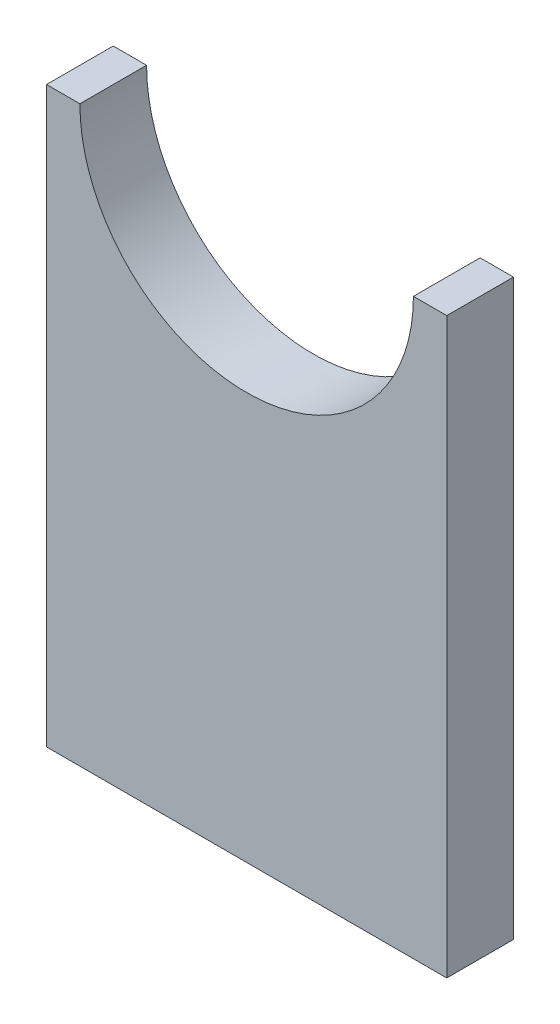
ISO-10303-21;
HEADER;
FILE_DESCRIPTION(('STEP AP214'),'2;1');
FILE_NAME('part.step','',(''),(''),'','','');
FILE_SCHEMA(('AUTOMOTIVE_DESIGN { 1 0 10303 214 1 1 1 1 }'));
ENDSEC;
DATA;
#1=APPLICATION_CONTEXT('core data for automotive mechanical design processes');
#2=APPLICATION_PROTOCOL_DEFINITION('international standard','automotive_design',2000,#1);
#3=PRODUCT_CONTEXT('',#1,'mechanical');
#4=PRODUCT('Part','Part','',(#3));
#5=PRODUCT_RELATED_PRODUCT_CATEGORY('part','',(#4));
#6=PRODUCT_DEFINITION_FORMATION('','',#4);
#7=PRODUCT_DEFINITION_CONTEXT('part definition',#1,'design');
#8=PRODUCT_DEFINITION('design','',#6,#7);
#9=PRODUCT_DEFINITION_SHAPE('','',#8);
#10=(LENGTH_UNIT() NAMED_UNIT(*) SI_UNIT(.MILLI.,.METRE.));
#11=(NAMED_UNIT(*) PLANE_ANGLE_UNIT() SI_UNIT($,.RADIAN.));
#12=(NAMED_UNIT(*) SI_UNIT($,.STERADIAN.) SOLID_ANGLE_UNIT());
#13=UNCERTAINTY_MEASURE_WITH_UNIT(LENGTH_MEASURE(1.E-05),#10,'distance_accuracy_value','');
#14=(GEOMETRIC_REPRESENTATION_CONTEXT(3) GLOBAL_UNCERTAINTY_ASSIGNED_CONTEXT((#13)) GLOBAL_UNIT_ASSIGNED_CONTEXT((#10,
#11,#12)) REPRESENTATION_CONTEXT('',''));
#15=CARTESIAN_POINT('',(0.,0.,0.));
#16=DIRECTION('',(0.,0.,1.));
#17=DIRECTION('',(1.,0.,0.));
#18=AXIS2_PLACEMENT_3D('',#15,#16,#17);
#19=CARTESIAN_POINT('',(-15.,21.5,5.));
#20=DIRECTION('',(0.,-1.,0.));
#21=DIRECTION('',(0.,0.,-1.));
#22=AXIS2_PLACEMENT_3D('',#19,#20,#21);
#23=PLANE('',#22);
#24=DIRECTION('',(-1.,0.,0.));
#25=VECTOR('',#24,1.);
#26=CARTESIAN_POINT('',(-15.,21.5,5.));
#27=LINE('',#26,#25);
#28=CARTESIAN_POINT('',(-12.5,21.5,5.));
#29=VERTEX_POINT('',#28);
#30=CARTESIAN_POINT('',(-15.,21.5,5.));
#31=VERTEX_POINT('',#30);
#32=EDGE_CURVE('E103',#29,#31,#27,.T.);
#33=ORIENTED_EDGE('',*,*,#32,.F.);
#34=DIRECTION('',(0.,0.,-1.));
#35=VECTOR('',#34,1.);
#36=CARTESIAN_POINT('',(-12.5,21.5,5.));
#37=LINE('',#36,#35);
#38=CARTESIAN_POINT('',(-12.5,21.5,0.));
#39=VERTEX_POINT('',#38);
#40=EDGE_CURVE('E93',#29,#39,#37,.T.);
#41=ORIENTED_EDGE('',*,*,#40,.T.);
#42=DIRECTION('',(-1.,0.,0.));
#43=VECTOR('',#42,1.);
#44=CARTESIAN_POINT('',(-15.,21.5,0.));
#45=LINE('',#44,#43);
#46=CARTESIAN_POINT('',(-15.,21.5,0.));
#47=VERTEX_POINT('',#46);
#48=EDGE_CURVE('E119',#39,#47,#45,.T.);
#49=ORIENTED_EDGE('',*,*,#48,.T.);
#50=DIRECTION('',(0.,0.,-1.));
#51=VECTOR('',#50,1.);
#52=CARTESIAN_POINT('',(-15.,21.5,5.));
#53=LINE('',#52,#51);
#54=EDGE_CURVE('E107',#31,#47,#53,.T.);
#55=ORIENTED_EDGE('',*,*,#54,.F.);
#56=EDGE_LOOP('',(#33,#41,#49,#55));
#57=FACE_BOUND('',#56,.T.);
#58=ADVANCED_FACE('F33',(#57),#23,.F.);
#59=CARTESIAN_POINT('',(15.,21.5,5.));
#60=DIRECTION('',(-1.,0.,0.));
#61=DIRECTION('',(0.,-1.,0.));
#62=AXIS2_PLACEMENT_3D('',#59,#60,#61);
#63=PLANE('',#62);
#64=DIRECTION('',(0.,1.,0.));
#65=VECTOR('',#64,1.);
#66=CARTESIAN_POINT('',(15.,21.5,0.));
#67=LINE('',#66,#65);
#68=CARTESIAN_POINT('',(15.,-21.5,0.));
#69=VERTEX_POINT('',#68);
#70=CARTESIAN_POINT('',(15.,21.5,0.));
#71=VERTEX_POINT('',#70);
#72=EDGE_CURVE('E100',#69,#71,#67,.T.);
#73=ORIENTED_EDGE('',*,*,#72,.T.);
#74=DIRECTION('',(0.,0.,-1.));
#75=VECTOR('',#74,1.);
#76=CARTESIAN_POINT('',(15.,21.5,5.));
#77=LINE('',#76,#75);
#78=CARTESIAN_POINT('',(15.,21.5,5.));
#79=VERTEX_POINT('',#78);
#80=EDGE_CURVE('E41',#79,#71,#77,.T.);
#81=ORIENTED_EDGE('',*,*,#80,.F.);
#82=DIRECTION('',(0.,1.,0.));
#83=VECTOR('',#82,1.);
#84=CARTESIAN_POINT('',(15.,21.5,5.));
#85=LINE('',#84,#83);
#86=CARTESIAN_POINT('',(15.,-21.5,5.));
#87=VERTEX_POINT('',#86);
#88=EDGE_CURVE('E109',#87,#79,#85,.T.);
#89=ORIENTED_EDGE('',*,*,#88,.F.);
#90=DIRECTION('',(0.,0.,-1.));
#91=VECTOR('',#90,1.);
#92=CARTESIAN_POINT('',(15.,-21.5,5.));
#93=LINE('',#92,#91);
#94=EDGE_CURVE('E116',#87,#69,#93,.T.);
#95=ORIENTED_EDGE('',*,*,#94,.T.);
#96=EDGE_LOOP('',(#73,#81,#89,#95));
#97=FACE_BOUND('',#96,.T.);
#98=ADVANCED_FACE('F35',(#97),#63,.F.);
#99=CARTESIAN_POINT('',(12.5,21.5,0.));
#100=VERTEX_POINT('',#99);
#101=EDGE_CURVE('E120',#71,#100,#45,.T.);
#102=ORIENTED_EDGE('',*,*,#101,.T.);
#103=DIRECTION('',(0.,0.,-1.));
#104=VECTOR('',#103,1.);
#105=CARTESIAN_POINT('',(12.5,21.5,5.));
#106=LINE('',#105,#104);
#107=CARTESIAN_POINT('',(12.5,21.5,5.));
#108=VERTEX_POINT('',#107);
#109=EDGE_CURVE('E48',#100,#108,#106,.F.);
#110=ORIENTED_EDGE('',*,*,#109,.T.);
#111=EDGE_CURVE('E84',#79,#108,#27,.T.);
#112=ORIENTED_EDGE('',*,*,#111,.F.);
#113=ORIENTED_EDGE('',*,*,#80,.T.);
#114=EDGE_LOOP('',(#102,#110,#112,#113));
#115=FACE_BOUND('',#114,.T.);
#116=ADVANCED_FACE('F130',(#115),#23,.F.);
#117=CARTESIAN_POINT('',(-15.,21.5,5.));
#118=DIRECTION('',(1.,0.,0.));
#119=DIRECTION('',(0.,1.,0.));
#120=AXIS2_PLACEMENT_3D('',#117,#118,#119);
#121=PLANE('',#120);
#122=DIRECTION('',(0.,-1.,0.));
#123=VECTOR('',#122,1.);
#124=CARTESIAN_POINT('',(-15.,21.5,0.));
#125=LINE('',#124,#123);
#126=CARTESIAN_POINT('',(-15.,-21.5,0.));
#127=VERTEX_POINT('',#126);
#128=EDGE_CURVE('E123',#47,#127,#125,.T.);
#129=ORIENTED_EDGE('',*,*,#128,.T.);
#130=DIRECTION('',(0.,0.,-1.));
#131=VECTOR('',#130,1.);
#132=CARTESIAN_POINT('',(-15.,-21.5,5.));
#133=LINE('',#132,#131);
#134=CARTESIAN_POINT('',(-15.,-21.5,5.));
#135=VERTEX_POINT('',#134);
#136=EDGE_CURVE('E127',#135,#127,#133,.T.);
#137=ORIENTED_EDGE('',*,*,#136,.F.);
#138=DIRECTION('',(0.,-1.,0.));
#139=VECTOR('',#138,1.);
#140=CARTESIAN_POINT('',(-15.,21.5,5.));
#141=LINE('',#140,#139);
#142=EDGE_CURVE('E111',#31,#135,#141,.T.);
#143=ORIENTED_EDGE('',*,*,#142,.F.);
#144=ORIENTED_EDGE('',*,*,#54,.T.);
#145=EDGE_LOOP('',(#129,#137,#143,#144));
#146=FACE_BOUND('',#145,.T.);
#147=ADVANCED_FACE('F138',(#146),#121,.F.);
#148=CARTESIAN_POINT('',(-15.,-21.5,5.));
#149=DIRECTION('',(0.,1.,0.));
#150=DIRECTION('',(0.,0.,1.));
#151=AXIS2_PLACEMENT_3D('',#148,#149,#150);
#152=PLANE('',#151);
#153=DIRECTION('',(1.,0.,0.));
#154=VECTOR('',#153,1.);
#155=CARTESIAN_POINT('',(-15.,-21.5,0.));
#156=LINE('',#155,#154);
#157=EDGE_CURVE('E77',#127,#69,#156,.T.);
#158=ORIENTED_EDGE('',*,*,#157,.T.);
#159=ORIENTED_EDGE('',*,*,#94,.F.);
#160=DIRECTION('',(1.,0.,0.));
#161=VECTOR('',#160,1.);
#162=CARTESIAN_POINT('',(-15.,-21.5,5.));
#163=LINE('',#162,#161);
#164=EDGE_CURVE('E56',#135,#87,#163,.T.);
#165=ORIENTED_EDGE('',*,*,#164,.F.);
#166=ORIENTED_EDGE('',*,*,#136,.T.);
#167=EDGE_LOOP('',(#158,#159,#165,#166));
#168=FACE_BOUND('',#167,.T.);
#169=ADVANCED_FACE('F140',(#168),#152,.F.);
#170=CARTESIAN_POINT('',(0.,0.,5.));
#171=DIRECTION('',(0.,0.,1.));
#172=DIRECTION('',(1.,0.,0.));
#173=AXIS2_PLACEMENT_3D('',#170,#171,#172);
#174=PLANE('',#173);
#175=CARTESIAN_POINT('',(0.,21.5,5.));
#176=DIRECTION('',(0.,0.,-1.));
#177=DIRECTION('',(-1.,0.,0.));
#178=AXIS2_PLACEMENT_3D('',#175,#176,#177);
#179=CIRCLE('',#178,12.5);
#180=EDGE_CURVE('E96',#108,#29,#179,.T.);
#181=ORIENTED_EDGE('',*,*,#180,.T.);
#182=ORIENTED_EDGE('',*,*,#32,.T.);
#183=ORIENTED_EDGE('',*,*,#142,.T.);
#184=ORIENTED_EDGE('',*,*,#164,.T.);
#185=ORIENTED_EDGE('',*,*,#88,.T.);
#186=ORIENTED_EDGE('',*,*,#111,.T.);
#187=EDGE_LOOP('',(#181,#182,#183,#184,#185,#186));
#188=FACE_BOUND('',#187,.T.);
#189=ADVANCED_FACE('F102',(#188),#174,.T.);
#190=CARTESIAN_POINT('',(0.,0.,0.));
#191=DIRECTION('',(0.,0.,1.));
#192=DIRECTION('',(1.,0.,0.));
#193=AXIS2_PLACEMENT_3D('',#190,#191,#192);
#194=PLANE('',#193);
#195=ORIENTED_EDGE('',*,*,#48,.F.);
#196=CARTESIAN_POINT('',(0.,21.5,0.));
#197=DIRECTION('',(0.,0.,1.));
#198=DIRECTION('',(1.,0.,0.));
#199=AXIS2_PLACEMENT_3D('',#196,#197,#198);
#200=CIRCLE('',#199,12.5);
#201=EDGE_CURVE('E11',#39,#100,#200,.T.);
#202=ORIENTED_EDGE('',*,*,#201,.T.);
#203=ORIENTED_EDGE('',*,*,#101,.F.);
#204=ORIENTED_EDGE('',*,*,#72,.F.);
#205=ORIENTED_EDGE('',*,*,#157,.F.);
#206=ORIENTED_EDGE('',*,*,#128,.F.);
#207=EDGE_LOOP('',(#195,#202,#203,#204,#205,#206));
#208=FACE_BOUND('',#207,.T.);
#209=ADVANCED_FACE('F135',(#208),#194,.F.);
#210=CARTESIAN_POINT('',(0.,21.5,5.));
#211=DIRECTION('',(0.,0.,-1.));
#212=DIRECTION('',(-1.,0.,0.));
#213=AXIS2_PLACEMENT_3D('',#210,#211,#212);
#214=CYLINDRICAL_SURFACE('',#213,12.5);
#215=ORIENTED_EDGE('',*,*,#180,.F.);
#216=ORIENTED_EDGE('',*,*,#109,.F.);
#217=ORIENTED_EDGE('',*,*,#201,.F.);
#218=ORIENTED_EDGE('',*,*,#40,.F.);
#219=EDGE_LOOP('',(#215,#216,#217,#218));
#220=FACE_BOUND('',#219,.T.);
#221=ADVANCED_FACE('F95',(#220),#214,.F.);
#222=CLOSED_SHELL('',(#58,#98,#116,#147,#169,#189,#209,#221));
#223=MANIFOLD_SOLID_BREP('B2',#222);
#224=ADVANCED_BREP_SHAPE_REPRESENTATION('',(#18,#223),#14);
#225=SHAPE_DEFINITION_REPRESENTATION(#9,#224);
ENDSEC;
END-ISO-10303-21;
